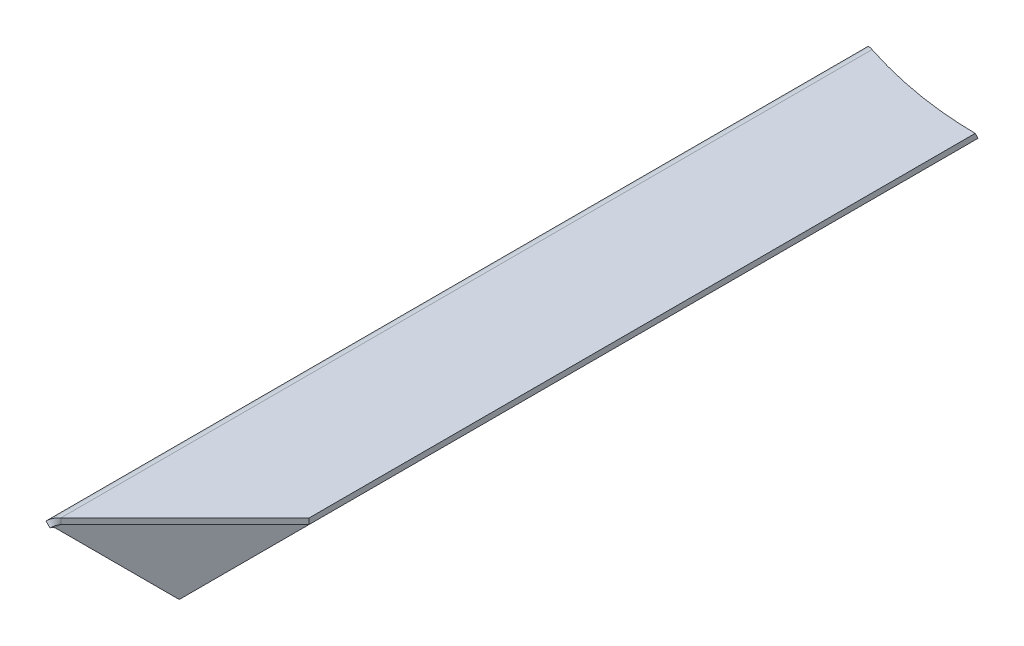
ISO-10303-21;
HEADER;
FILE_DESCRIPTION(('STEP AP214'),'2;1');
FILE_NAME('part.step','',(''),(''),'','','');
FILE_SCHEMA(('AUTOMOTIVE_DESIGN { 1 0 10303 214 1 1 1 1 }'));
ENDSEC;
DATA;
#1=APPLICATION_CONTEXT('core data for automotive mechanical design processes');
#2=APPLICATION_PROTOCOL_DEFINITION('international standard','automotive_design',2000,#1);
#3=PRODUCT_CONTEXT('',#1,'mechanical');
#4=PRODUCT('Part','Part','',(#3));
#5=PRODUCT_RELATED_PRODUCT_CATEGORY('part','',(#4));
#6=PRODUCT_DEFINITION_FORMATION('','',#4);
#7=PRODUCT_DEFINITION_CONTEXT('part definition',#1,'design');
#8=PRODUCT_DEFINITION('design','',#6,#7);
#9=PRODUCT_DEFINITION_SHAPE('','',#8);
#10=(LENGTH_UNIT() NAMED_UNIT(*) SI_UNIT(.MILLI.,.METRE.));
#11=(NAMED_UNIT(*) PLANE_ANGLE_UNIT() SI_UNIT($,.RADIAN.));
#12=(NAMED_UNIT(*) SI_UNIT($,.STERADIAN.) SOLID_ANGLE_UNIT());
#13=UNCERTAINTY_MEASURE_WITH_UNIT(LENGTH_MEASURE(1.E-05),#10,'distance_accuracy_value','');
#14=(GEOMETRIC_REPRESENTATION_CONTEXT(3) GLOBAL_UNCERTAINTY_ASSIGNED_CONTEXT((#13)) GLOBAL_UNIT_ASSIGNED_CONTEXT((#10,
#11,#12)) REPRESENTATION_CONTEXT('',''));
#15=CARTESIAN_POINT('',(0.,0.,0.));
#16=DIRECTION('',(0.,0.,1.));
#17=DIRECTION('',(1.,0.,0.));
#18=AXIS2_PLACEMENT_3D('',#15,#16,#17);
#19=CARTESIAN_POINT('',(-75.3461789999995,0.188336430725022,0.));
#20=DIRECTION('',(-1.,0.,0.));
#21=DIRECTION('',(0.,0.,1.));
#22=AXIS2_PLACEMENT_3D('',#19,#20,#21);
#23=PLANE('',#22);
#24=CARTESIAN_POINT('',(-75.3461789999999,59.5929013098403,-85.4549348179385));
#25=DIRECTION('',(-1.,0.,0.));
#26=DIRECTION('',(0.,-0.896707047194471,-0.442624526559218));
#27=AXIS2_PLACEMENT_3D('',#24,#25,#26);
#28=ELLIPSE('',#27,107.55436377684,44.45);
#29=CARTESIAN_POINT('',(-75.3461789999999,57.8815154307376,-37.5648409427278));
#30=VERTEX_POINT('',#29);
#31=CARTESIAN_POINT('',(-75.346179,73.8729789999998,-31.7875124451555));
#32=VERTEX_POINT('',#31);
#33=EDGE_CURVE('E53',#30,#32,#28,.T.);
#34=ORIENTED_EDGE('',*,*,#33,.F.);
#35=DIRECTION('',(0.,0.,-1.));
#36=VECTOR('',#35,1.);
#37=CARTESIAN_POINT('',(-75.3461789999999,57.8815154307375,57.6931790000015));
#38=LINE('',#37,#36);
#39=CARTESIAN_POINT('',(-75.3461789999999,57.8815154307375,57.6931790000015));
#40=VERTEX_POINT('',#39);
#41=EDGE_CURVE('E185',#40,#30,#38,.T.);
#42=ORIENTED_EDGE('',*,*,#41,.F.);
#43=DIRECTION('',(0.,-0.707106781186615,-0.70710678118648));
#44=VECTOR('',#43,1.);
#45=CARTESIAN_POINT('',(-75.346179,74.7407654307376,74.5524289999984));
#46=LINE('',#45,#44);
#47=CARTESIAN_POINT('',(-75.346179,73.8729789999997,73.6846425692607));
#48=VERTEX_POINT('',#47);
#49=EDGE_CURVE('E60',#48,#40,#46,.T.);
#50=ORIENTED_EDGE('',*,*,#49,.F.);
#51=DIRECTION('',(0.,0.,-1.));
#52=VECTOR('',#51,1.);
#53=CARTESIAN_POINT('',(-75.346179,73.8729789999997,0.));
#54=LINE('',#53,#52);
#55=EDGE_CURVE('E187',#48,#32,#54,.T.);
#56=ORIENTED_EDGE('',*,*,#55,.T.);
#57=EDGE_LOOP('',(#34,#42,#50,#56));
#58=FACE_BOUND('',#57,.T.);
#59=ADVANCED_FACE('F32',(#58),#23,.T.);
#60=CARTESIAN_POINT('',(-74.6095790000001,74.7407654307376,74.5524289999984));
#61=DIRECTION('',(0.,0.70710678118648,-0.707106781186615));
#62=DIRECTION('',(0.,0.707106781186615,0.70710678118648));
#63=AXIS2_PLACEMENT_3D('',#60,#61,#62);
#64=PLANE('',#63);
#65=CARTESIAN_POINT('',(-75.346179,73.8729789999997,73.6846425692607));
#66=CARTESIAN_POINT('',(-74.6095790000001,73.8729789999997,73.6846425692607));
#67=B_SPLINE_CURVE_WITH_KNOTS('',1,(#65,#66),.UNSPECIFIED.,.F.,.F.,(2,2),(0.,1.),.UNSPECIFIED.);
#68=CARTESIAN_POINT('',(-74.6095790000001,73.8729789999997,73.6846425692607));
#69=VERTEX_POINT('',#68);
#70=EDGE_CURVE('E46',#48,#69,#67,.T.);
#71=ORIENTED_EDGE('',*,*,#70,.F.);
#72=ORIENTED_EDGE('',*,*,#49,.T.);
#73=DIRECTION('',(-1.,0.,0.));
#74=VECTOR('',#73,1.);
#75=CARTESIAN_POINT('',(-74.6095789999999,57.8815154307375,57.6931790000015));
#76=LINE('',#75,#74);
#77=CARTESIAN_POINT('',(-74.6095789999999,57.8815154307375,57.6931790000015));
#78=VERTEX_POINT('',#77);
#79=EDGE_CURVE('E195',#78,#40,#76,.T.);
#80=ORIENTED_EDGE('',*,*,#79,.F.);
#81=DIRECTION('',(0.,-0.707106781186615,-0.70710678118648));
#82=VECTOR('',#81,1.);
#83=CARTESIAN_POINT('',(-74.6095790000001,74.7407654307376,74.5524289999984));
#84=LINE('',#83,#82);
#85=EDGE_CURVE('E196',#69,#78,#84,.T.);
#86=ORIENTED_EDGE('',*,*,#85,.F.);
#87=EDGE_LOOP('',(#71,#72,#80,#86));
#88=FACE_BOUND('',#87,.T.);
#89=ADVANCED_FACE('F34',(#88),#64,.F.);
#90=CARTESIAN_POINT('',(-74.6095789999999,57.8815154307375,57.6931790000015));
#91=DIRECTION('',(0.,1.,0.));
#92=DIRECTION('',(0.,0.,1.));
#93=AXIS2_PLACEMENT_3D('',#90,#91,#92);
#94=PLANE('',#93);
#95=ORIENTED_EDGE('',*,*,#41,.T.);
#96=CARTESIAN_POINT('',(-76.2123654834743,57.8815154307376,-86.2996938358005));
#97=DIRECTION('',(0.,1.,0.));
#98=DIRECTION('',(-0.715906273876113,0.,-0.698196395740353));
#99=AXIS2_PLACEMENT_3D('',#96,#97,#98);
#100=ELLIPSE('',#99,54.436662870583,44.45);
#101=CARTESIAN_POINT('',(-74.6095789999999,57.8815154307376,-37.4361436470366));
#102=VERTEX_POINT('',#101);
#103=EDGE_CURVE('E192',#30,#102,#100,.T.);
#104=ORIENTED_EDGE('',*,*,#103,.T.);
#105=DIRECTION('',(0.,0.,-1.));
#106=VECTOR('',#105,1.);
#107=CARTESIAN_POINT('',(-74.6095789999999,57.8815154307375,57.6931790000015));
#108=LINE('',#107,#106);
#109=EDGE_CURVE('E198',#78,#102,#108,.T.);
#110=ORIENTED_EDGE('',*,*,#109,.F.);
#111=ORIENTED_EDGE('',*,*,#79,.T.);
#112=EDGE_LOOP('',(#95,#104,#110,#111));
#113=FACE_BOUND('',#112,.T.);
#114=ADVANCED_FACE('F171',(#113),#94,.F.);
#115=CARTESIAN_POINT('',(-74.6095789999995,0.188336430725022,0.));
#116=DIRECTION('',(-1.,0.,0.));
#117=DIRECTION('',(0.,0.,1.));
#118=AXIS2_PLACEMENT_3D('',#115,#116,#117);
#119=PLANE('',#118);
#120=ORIENTED_EDGE('',*,*,#109,.T.);
#121=CARTESIAN_POINT('',(-74.609579,61.0482540111322,-84.7365566113643));
#122=DIRECTION('',(-1.,0.,0.));
#123=DIRECTION('',(0.,-0.896707047194471,-0.442624526559218));
#124=AXIS2_PLACEMENT_3D('',#121,#122,#123);
#125=ELLIPSE('',#124,107.55436377684,44.45);
#126=CARTESIAN_POINT('',(-74.609579,73.8729789999997,-31.5411856559985));
#127=VERTEX_POINT('',#126);
#128=EDGE_CURVE('E273',#102,#127,#125,.T.);
#129=ORIENTED_EDGE('',*,*,#128,.T.);
#130=DIRECTION('',(0.,0.,-1.));
#131=VECTOR('',#130,1.);
#132=CARTESIAN_POINT('',(-74.609579,73.8729789999997,0.));
#133=LINE('',#132,#131);
#134=EDGE_CURVE('E205',#69,#127,#133,.T.);
#135=ORIENTED_EDGE('',*,*,#134,.F.);
#136=ORIENTED_EDGE('',*,*,#85,.T.);
#137=EDGE_LOOP('',(#120,#129,#135,#136));
#138=FACE_BOUND('',#137,.T.);
#139=ADVANCED_FACE('F174',(#138),#119,.F.);
#140=CARTESIAN_POINT('',(-57.8815154307379,74.6095789999998,57.6931790000015));
#141=DIRECTION('',(-1.,0.,0.));
#142=DIRECTION('',(0.,0.,-1.));
#143=AXIS2_PLACEMENT_3D('',#140,#141,#142);
#144=PLANE('',#143);
#145=DIRECTION('',(0.,0.,1.));
#146=VECTOR('',#145,1.);
#147=CARTESIAN_POINT('',(-57.8815154307379,74.6095789999998,57.6931790000015));
#148=LINE('',#147,#146);
#149=CARTESIAN_POINT('',(-57.8815154307379,74.6095789999998,-28.4723694186372));
#150=VERTEX_POINT('',#149);
#151=CARTESIAN_POINT('',(-57.8815154307379,74.6095789999998,57.6931790000015));
#152=VERTEX_POINT('',#151);
#153=EDGE_CURVE('E141',#150,#152,#148,.T.);
#154=ORIENTED_EDGE('',*,*,#153,.F.);
#155=CARTESIAN_POINT('',(-57.8815154307379,94.0990719624067,-68.4223069421464));
#156=DIRECTION('',(-1.,0.,0.));
#157=DIRECTION('',(0.,-0.896707047194472,-0.442624526559218));
#158=AXIS2_PLACEMENT_3D('',#155,#156,#157);
#159=ELLIPSE('',#158,107.554363776841,44.45);
#160=CARTESIAN_POINT('',(-57.8815154307379,75.3461789999998,-28.1109438259411));
#161=VERTEX_POINT('',#160);
#162=EDGE_CURVE('E120',#150,#161,#159,.T.);
#163=ORIENTED_EDGE('',*,*,#162,.T.);
#164=DIRECTION('',(0.,0.,1.));
#165=VECTOR('',#164,1.);
#166=CARTESIAN_POINT('',(-57.8815154307379,75.3461789999998,57.6931790000015));
#167=LINE('',#166,#165);
#168=CARTESIAN_POINT('',(-57.8815154307379,75.3461789999998,57.6931790000015));
#169=VERTEX_POINT('',#168);
#170=EDGE_CURVE('E119',#161,#169,#167,.T.);
#171=ORIENTED_EDGE('',*,*,#170,.T.);
#172=DIRECTION('',(0.,1.,0.));
#173=VECTOR('',#172,1.);
#174=CARTESIAN_POINT('',(-57.8815154307379,74.6095789999998,57.6931790000015));
#175=LINE('',#174,#173);
#176=EDGE_CURVE('E200',#152,#169,#175,.T.);
#177=ORIENTED_EDGE('',*,*,#176,.F.);
#178=EDGE_LOOP('',(#154,#163,#171,#177));
#179=FACE_BOUND('',#178,.T.);
#180=ADVANCED_FACE('F177',(#179),#144,.F.);
#181=CARTESIAN_POINT('',(-149.29319443075,74.6095789999995,0.));
#182=DIRECTION('',(0.,1.,0.));
#183=DIRECTION('',(0.,0.,1.));
#184=AXIS2_PLACEMENT_3D('',#181,#182,#183);
#185=PLANE('',#184);
#186=DIRECTION('',(0.,0.,-1.));
#187=VECTOR('',#186,1.);
#188=CARTESIAN_POINT('',(-73.872979,74.6095789999997,0.));
#189=LINE('',#188,#187);
#190=CARTESIAN_POINT('',(-73.872979,74.6095789999997,73.6846425692607));
#191=VERTEX_POINT('',#190);
#192=CARTESIAN_POINT('',(-73.872979,74.6095789999997,-31.0599616019449));
#193=VERTEX_POINT('',#192);
#194=EDGE_CURVE('E138',#191,#193,#189,.T.);
#195=ORIENTED_EDGE('',*,*,#194,.T.);
#196=CARTESIAN_POINT('',(-67.7457638039089,74.6095789999998,-78.0425364500491));
#197=DIRECTION('',(0.,1.,0.));
#198=DIRECTION('',(-0.715906273876111,0.,-0.698196395740356));
#199=AXIS2_PLACEMENT_3D('',#196,#197,#198);
#200=ELLIPSE('',#199,54.4366628705829,44.45);
#201=EDGE_CURVE('E188',#193,#150,#200,.T.);
#202=ORIENTED_EDGE('',*,*,#201,.T.);
#203=ORIENTED_EDGE('',*,*,#153,.T.);
#204=DIRECTION('',(-0.707106781186614,0.,0.707106781186481));
#205=VECTOR('',#204,1.);
#206=CARTESIAN_POINT('',(-74.7407654307379,74.6095789999997,74.5524289999984));
#207=LINE('',#206,#205);
#208=EDGE_CURVE('E131',#152,#191,#207,.T.);
#209=ORIENTED_EDGE('',*,*,#208,.T.);
#210=EDGE_LOOP('',(#195,#202,#203,#209));
#211=FACE_BOUND('',#210,.T.);
#212=ADVANCED_FACE('F341',(#211),#185,.F.);
#213=CARTESIAN_POINT('',(-149.29319443075,75.3461789999995,0.));
#214=DIRECTION('',(0.,1.,0.));
#215=DIRECTION('',(0.,0.,1.));
#216=AXIS2_PLACEMENT_3D('',#213,#214,#215);
#217=PLANE('',#216);
#218=CARTESIAN_POINT('',(-67.3729472629299,75.3461789999998,-77.6789425346409));
#219=DIRECTION('',(0.,1.,0.));
#220=DIRECTION('',(-0.715906273876111,0.,-0.698196395740356));
#221=AXIS2_PLACEMENT_3D('',#218,#219,#220);
#222=ELLIPSE('',#221,54.4366628705829,44.45);
#223=CARTESIAN_POINT('',(-73.872979,75.3461789999998,-30.8169524684756));
#224=VERTEX_POINT('',#223);
#225=EDGE_CURVE('E108',#224,#161,#222,.T.);
#226=ORIENTED_EDGE('',*,*,#225,.F.);
#227=DIRECTION('',(0.,0.,-1.));
#228=VECTOR('',#227,1.);
#229=CARTESIAN_POINT('',(-73.872979,75.3461789999998,0.));
#230=LINE('',#229,#228);
#231=CARTESIAN_POINT('',(-73.8729790000001,75.3461789999997,73.6846425692607));
#232=VERTEX_POINT('',#231);
#233=EDGE_CURVE('E118',#232,#224,#230,.T.);
#234=ORIENTED_EDGE('',*,*,#233,.F.);
#235=DIRECTION('',(-0.707106781186614,0.,0.707106781186481));
#236=VECTOR('',#235,1.);
#237=CARTESIAN_POINT('',(-74.7407654307379,75.3461789999997,74.5524289999984));
#238=LINE('',#237,#236);
#239=EDGE_CURVE('E157',#169,#232,#238,.T.);
#240=ORIENTED_EDGE('',*,*,#239,.F.);
#241=ORIENTED_EDGE('',*,*,#170,.F.);
#242=EDGE_LOOP('',(#226,#234,#240,#241));
#243=FACE_BOUND('',#242,.T.);
#244=ADVANCED_FACE('F116',(#243),#217,.T.);
#245=CARTESIAN_POINT('',(-74.7407654307379,74.6095789999997,74.5524289999984));
#246=DIRECTION('',(-0.707106781186481,0.,-0.707106781186614));
#247=DIRECTION('',(0.707106781186614,0.,-0.707106781186481));
#248=AXIS2_PLACEMENT_3D('',#245,#246,#247);
#249=PLANE('',#248);
#250=ORIENTED_EDGE('',*,*,#239,.T.);
#251=CARTESIAN_POINT('',(-73.872979,74.6095789999997,73.6846425692607));
#252=CARTESIAN_POINT('',(-73.8729790000001,75.3461789999997,73.6846425692607));
#253=B_SPLINE_CURVE_WITH_KNOTS('',1,(#251,#252),.UNSPECIFIED.,.F.,.F.,(2,2),(0.,1.),.UNSPECIFIED.);
#254=EDGE_CURVE('E152',#232,#191,#253,.F.);
#255=ORIENTED_EDGE('',*,*,#254,.T.);
#256=ORIENTED_EDGE('',*,*,#208,.F.);
#257=ORIENTED_EDGE('',*,*,#176,.T.);
#258=EDGE_LOOP('',(#250,#255,#256,#257));
#259=FACE_BOUND('',#258,.T.);
#260=ADVANCED_FACE('F159',(#259),#249,.F.);
#261=CARTESIAN_POINT('',(-74.9146887100441,74.9146887100437,74.5524289999984));
#262=CARTESIAN_POINT('',(-75.0510639267768,74.778313493311,74.4077812391921));
#263=CARTESIAN_POINT('',(-75.1602411073236,74.6149104818821,74.2631668564191));
#264=CARTESIAN_POINT('',(-75.3078355472678,74.2585859832378,73.9739047128399));
#265=CARTESIAN_POINT('',(-75.346179,74.0658426810747,73.8292903300669));
#266=CARTESIAN_POINT('',(-75.346179,73.8729789999997,73.6846425692607));
#267=CARTESIAN_POINT('',(-74.3938338550221,74.3938338550217,74.5524289999984));
#268=CARTESIAN_POINT('',(-74.4620173784557,74.3256503315881,74.4077899046431));
#269=CARTESIAN_POINT('',(-74.5166100536618,74.2439447409409,74.2631668564191));
#270=CARTESIAN_POINT('',(-74.5904072736339,74.0657824916188,73.9739047128399));
#271=CARTESIAN_POINT('',(-74.6095790000001,73.9694050635699,73.829281664616));
#272=CARTESIAN_POINT('',(-74.6095790000001,73.8729789999997,73.6846425692607));
#273=B_SPLINE_SURFACE_WITH_KNOTS('',1,3,((#261,#262,#263,#264,#265,#266),(#267,#268,#269,#270,
#271,#272)),.UNSPECIFIED.,.F.,.F.,.F.,(2,2),(4,2,4),(0.,1.),(0.,0.5,1.),.UNSPECIFIED.);
#274=CARTESIAN_POINT('',(-74.9146887100441,74.9146887100437,74.5524289999984));
#275=CARTESIAN_POINT('',(-74.3938338550221,74.3938338550217,74.5524289999984));
#276=B_SPLINE_CURVE_WITH_KNOTS('',1,(#274,#275),.UNSPECIFIED.,.F.,.F.,(2,2),(0.,1.),.UNSPECIFIED.);
#277=CARTESIAN_POINT('',(-74.9146889457465,74.9146884743413,74.5524287499982));
#278=VERTEX_POINT('',#277);
#279=CARTESIAN_POINT('',(-74.3938338550221,74.3938338550217,74.5524289999984));
#280=VERTEX_POINT('',#279);
#281=EDGE_CURVE('E129',#278,#280,#276,.T.);
#282=CARTESIAN_POINT('',(-74.9146887100441,74.9146887100437,74.5524289999984));
#283=CARTESIAN_POINT('',(-75.0510639267768,74.778313493311,74.4077812391921));
#284=CARTESIAN_POINT('',(-75.1602411073236,74.6149104818821,74.2631668564191));
#285=CARTESIAN_POINT('',(-75.3078355472678,74.2585859832378,73.9739047128399));
#286=CARTESIAN_POINT('',(-75.346179,74.0658426810747,73.8292903300669));
#287=CARTESIAN_POINT('',(-75.346179,73.8729789999997,73.6846425692607));
#288=B_SPLINE_CURVE_WITH_KNOTS('',3,(#282,#283,#284,#285,#286,#287),.UNSPECIFIED.,.F.,.F.,(4,2,
4),(0.,0.5,1.),.UNSPECIFIED.);
#289=EDGE_CURVE('E234',#278,#48,#288,.T.);
#290=CARTESIAN_POINT('',(-74.6095790000001,73.8729789999997,73.6846425692607));
#291=CARTESIAN_POINT('',(-74.6095790000001,73.9694050635699,73.829281664616));
#292=CARTESIAN_POINT('',(-74.5904072736339,74.0657824916188,73.9739047128399));
#293=CARTESIAN_POINT('',(-74.5166100536618,74.2439447409409,74.2631668564191));
#294=CARTESIAN_POINT('',(-74.4620173784557,74.3256503315881,74.4077899046431));
#295=CARTESIAN_POINT('',(-74.3938338550221,74.3938338550217,74.5524289999984));
#296=B_SPLINE_CURVE_WITH_KNOTS('',3,(#290,#291,#292,#293,#294,#295),.UNSPECIFIED.,.F.,.F.,(4,2,
4),(0.,0.5,1.),.UNSPECIFIED.);
#297=EDGE_CURVE('E231',#280,#69,#296,.F.);
#298=ORIENTED_EDGE('',*,*,#281,.F.);
#299=ORIENTED_EDGE('',*,*,#289,.T.);
#300=ORIENTED_EDGE('',*,*,#70,.T.);
#301=ORIENTED_EDGE('',*,*,#297,.F.);
#302=EDGE_LOOP('',(#298,#299,#300,#301));
#303=FACE_BOUND('',#302,.T.);
#304=ADVANCED_FACE('F169',(#303),#273,.F.);
#305=CARTESIAN_POINT('',(-73.8729790000001,75.3461789999997,73.6846425692607));
#306=CARTESIAN_POINT('',(-74.065842681075,75.3461789999997,73.8292903300669));
#307=CARTESIAN_POINT('',(-74.2585859832381,75.3078355472675,73.9739047128399));
#308=CARTESIAN_POINT('',(-74.6149104818825,75.1602411073232,74.2631668564191));
#309=CARTESIAN_POINT('',(-74.7783134933114,75.0510639267765,74.4077812391921));
#310=CARTESIAN_POINT('',(-74.9146887100441,74.9146887100437,74.5524289999984));
#311=CARTESIAN_POINT('',(-73.872979,74.6095789999997,73.6846425692607));
#312=CARTESIAN_POINT('',(-73.9694050635703,74.6095789999997,73.829281664616));
#313=CARTESIAN_POINT('',(-74.0657824916191,74.5904072736336,73.9739047128399));
#314=CARTESIAN_POINT('',(-74.2439447409413,74.5166100536615,74.2631668564191));
#315=CARTESIAN_POINT('',(-74.3256503315884,74.4620173784554,74.4077899046431));
#316=CARTESIAN_POINT('',(-74.3938338550221,74.3938338550217,74.5524289999984));
#317=B_SPLINE_SURFACE_WITH_KNOTS('',1,3,((#305,#306,#307,#308,#309,#310),(#311,#312,#313,#314,
#315,#316)),.UNSPECIFIED.,.F.,.F.,.F.,(2,2),(4,2,4),(0.,1.),(0.,0.5,1.),.UNSPECIFIED.);
#318=CARTESIAN_POINT('',(-73.8729790000001,75.3461789999997,73.6846425692607));
#319=CARTESIAN_POINT('',(-74.065842681075,75.3461789999997,73.8292903300669));
#320=CARTESIAN_POINT('',(-74.2585859832381,75.3078355472675,73.9739047128399));
#321=CARTESIAN_POINT('',(-74.6149104818825,75.1602411073232,74.2631668564191));
#322=CARTESIAN_POINT('',(-74.7783134933114,75.0510639267765,74.4077812391921));
#323=CARTESIAN_POINT('',(-74.9146887100441,74.9146887100437,74.5524289999984));
#324=B_SPLINE_CURVE_WITH_KNOTS('',3,(#318,#319,#320,#321,#322,#323),.UNSPECIFIED.,.F.,.F.,(4,2,
4),(0.,0.5,1.),.UNSPECIFIED.);
#325=EDGE_CURVE('E126',#232,#278,#324,.T.);
#326=CARTESIAN_POINT('',(-74.3938338550221,74.3938338550217,74.5524289999984));
#327=CARTESIAN_POINT('',(-74.3256503315884,74.4620173784554,74.4077899046431));
#328=CARTESIAN_POINT('',(-74.2439447409413,74.5166100536615,74.2631668564191));
#329=CARTESIAN_POINT('',(-74.0657824916191,74.5904072736336,73.9739047128399));
#330=CARTESIAN_POINT('',(-73.9694050635703,74.6095789999997,73.829281664616));
#331=CARTESIAN_POINT('',(-73.872979,74.6095789999997,73.6846425692607));
#332=B_SPLINE_CURVE_WITH_KNOTS('',3,(#326,#327,#328,#329,#330,#331),.UNSPECIFIED.,.F.,.F.,(4,2,
4),(0.,0.5,1.),.UNSPECIFIED.);
#333=EDGE_CURVE('E133',#191,#280,#332,.F.);
#334=ORIENTED_EDGE('',*,*,#325,.T.);
#335=ORIENTED_EDGE('',*,*,#281,.T.);
#336=ORIENTED_EDGE('',*,*,#333,.F.);
#337=ORIENTED_EDGE('',*,*,#254,.F.);
#338=EDGE_LOOP('',(#334,#335,#336,#337));
#339=FACE_BOUND('',#338,.T.);
#340=ADVANCED_FACE('F261',(#339),#317,.F.);
#341=CARTESIAN_POINT('',(-73.8729790000001,73.8729789999997,149.116777969203));
#342=DIRECTION('',(0.,0.,-1.));
#343=DIRECTION('',(1.,0.,0.));
#344=AXIS2_PLACEMENT_3D('',#341,#342,#343);
#345=CYLINDRICAL_SURFACE('',#344,0.7366);
#346=CARTESIAN_POINT('',(-73.872979,74.6095789999998,-31.0599616019449));
#347=CARTESIAN_POINT('',(-73.9172662424923,74.6095976836771,-31.0741140961483));
#348=CARTESIAN_POINT('',(-73.9610672392346,74.6055896468219,-31.0895066671416));
#349=CARTESIAN_POINT('',(-74.046478976005,74.5901579664978,-31.1221278835133));
#350=CARTESIAN_POINT('',(-74.0880963143201,74.5787582420845,-31.1393504573321));
#351=CARTESIAN_POINT('',(-74.1681510051735,74.5491994117971,-31.1750546836289));
#352=CARTESIAN_POINT('',(-74.2065938641567,74.5310523242475,-31.1935340499885));
#353=CARTESIAN_POINT('',(-74.2795644663467,74.4886488645506,-31.2312626277672));
#354=CARTESIAN_POINT('',(-74.3140891247112,74.4643877264789,-31.2505124298511));
#355=CARTESIAN_POINT('',(-74.3804753225713,74.4087220556529,-31.2905020829446));
#356=CARTESIAN_POINT('',(-74.4120291083307,74.3769620710411,-31.3112590086713));
#357=CARTESIAN_POINT('',(-74.4689777250292,74.3081351018254,-31.3524942094557));
#358=CARTESIAN_POINT('',(-74.4943690228607,74.2710650921265,-31.3729723183407));
#359=CARTESIAN_POINT('',(-74.538596156863,74.1917831494913,-31.4134547199261));
#360=CARTESIAN_POINT('',(-74.5572906490857,74.1494831683073,-31.4334413317038));
#361=CARTESIAN_POINT('',(-74.5865337395116,74.061542391956,-31.4718331395567));
#362=CARTESIAN_POINT('',(-74.5971009286536,74.0159094843731,-31.4902418587087));
#363=CARTESIAN_POINT('',(-74.6053454838137,73.9534587937036,-31.513408467457));
#364=CARTESIAN_POINT('',(-74.6069282757365,73.9374644528648,-31.5191693548959));
#365=CARTESIAN_POINT('',(-74.609043898032,73.9053262430204,-31.5303993729878));
#366=CARTESIAN_POINT('',(-74.6095779635945,73.8891825724492,-31.5358688394774));
#367=CARTESIAN_POINT('',(-74.6095790000001,73.8729789999997,-31.5411856559985));
#368=B_SPLINE_CURVE_WITH_KNOTS('',3,(#346,#347,#348,#349,#350,#351,#352,#353,#354,#355,#356,
#357,#358,#359,#360,#361,#362,#363,#364,#365,#366,#367),.UNSPECIFIED.,.F.,.F.,(4,2,2,2,2,2,2,2,
2,2,4),(0.,0.139167439625803,0.277886774208337,0.416360198052857,0.554941898120739,
0.702312395164956,0.849767184843005,1.00017259320208,1.15023292235591,1.20142694822068,
1.25256064151897),.UNSPECIFIED.);
#369=EDGE_CURVE('E268',#193,#127,#368,.T.);
#370=ORIENTED_EDGE('',*,*,#369,.F.);
#371=ORIENTED_EDGE('',*,*,#194,.F.);
#372=ORIENTED_EDGE('',*,*,#333,.T.);
#373=ORIENTED_EDGE('',*,*,#297,.T.);
#374=ORIENTED_EDGE('',*,*,#134,.T.);
#375=EDGE_LOOP('',(#370,#371,#372,#373,#374));
#376=FACE_BOUND('',#375,.T.);
#377=ADVANCED_FACE('F241',(#376),#345,.F.);
#378=CARTESIAN_POINT('',(-73.8729790000001,73.8729789999997,149.116777969203));
#379=DIRECTION('',(0.,0.,-1.));
#380=DIRECTION('',(1.,0.,0.));
#381=AXIS2_PLACEMENT_3D('',#378,#379,#380);
#382=CYLINDRICAL_SURFACE('',#381,1.4732);
#383=ORIENTED_EDGE('',*,*,#233,.T.);
#384=CARTESIAN_POINT('',(-73.872979,75.3461789999998,-30.8169524684756));
#385=CARTESIAN_POINT('',(-73.96182227931,75.3462108767753,-30.8460091232986));
#386=CARTESIAN_POINT('',(-74.0496390138271,75.3381518031792,-30.8776235627689));
#387=CARTESIAN_POINT('',(-74.2208143372676,75.3071471344652,-30.9445821180585));
#388=CARTESIAN_POINT('',(-74.3041864920155,75.2842500226361,-30.9799137740321));
#389=CARTESIAN_POINT('',(-74.4645210710243,75.2249047250233,-31.0530571804885));
#390=CARTESIAN_POINT('',(-74.5414953189322,75.188482248381,-31.0908641143525));
#391=CARTESIAN_POINT('',(-74.6876083327173,75.1033649749589,-31.1679173026236));
#392=CARTESIAN_POINT('',(-74.7567406014893,75.0546601083027,-31.2071647153553));
#393=CARTESIAN_POINT('',(-74.8898259001445,74.9427398360714,-31.2886096283151));
#394=CARTESIAN_POINT('',(-74.9531407062403,74.8787815843709,-31.3308316095231));
#395=CARTESIAN_POINT('',(-75.0673607667348,74.7400685506052,-31.4144698571406));
#396=CARTESIAN_POINT('',(-75.1182591272132,74.6653078072387,-31.4558856642531));
#397=CARTESIAN_POINT('',(-75.2065654504487,74.5056842915088,-31.5372735262075));
#398=CARTESIAN_POINT('',(-75.2437568683735,74.420685380993,-31.5772141156037));
#399=CARTESIAN_POINT('',(-75.301730692997,74.2439169239766,-31.653601702518));
#400=CARTESIAN_POINT('',(-75.3225525450178,74.1521642395468,-31.6900569111279));
#401=CARTESIAN_POINT('',(-75.3383330454725,74.027939959129,-31.7351994669889));
#402=CARTESIAN_POINT('',(-75.3412665892142,73.9971361711498,-31.7460607980751));
#403=CARTESIAN_POINT('',(-75.3451874213407,73.9352519228214,-31.7672164556431));
#404=CARTESIAN_POINT('',(-75.3461769572002,73.9041718237429,-31.7775114234937));
#405=CARTESIAN_POINT('',(-75.346179,73.8729789999997,-31.7875124451555));
#406=B_SPLINE_CURVE_WITH_KNOTS('',3,(#384,#385,#386,#387,#388,#389,#390,#391,#392,#393,#394,
#395,#396,#397,#398,#399,#400,#401,#402,#403,#404,#405),.UNSPECIFIED.,.F.,.F.,(4,2,2,2,2,2,2,2,
2,2,4),(0.,0.279779093575057,0.558648587280031,0.83699069412902,1.11556174951556,
1.41242591905896,1.70945454175551,2.0109926903808,2.31180198395698,2.41013604469037,
2.50835635399897),.UNSPECIFIED.);
#407=EDGE_CURVE('E11',#224,#32,#406,.T.);
#408=ORIENTED_EDGE('',*,*,#407,.T.);
#409=ORIENTED_EDGE('',*,*,#55,.F.);
#410=ORIENTED_EDGE('',*,*,#289,.F.);
#411=ORIENTED_EDGE('',*,*,#325,.F.);
#412=EDGE_LOOP('',(#383,#408,#409,#410,#411));
#413=FACE_BOUND('',#412,.T.);
#414=ADVANCED_FACE('F123',(#413),#382,.T.);
#415=CARTESIAN_POINT('',(-40.3922364855664,128.653876953588,-51.3656726183498));
#416=DIRECTION('',(-0.413279372766564,-0.816545277686749,-0.403055789603802));
#417=DIRECTION('',(0.892228166379723,-0.451584874767388,0.));
#418=AXIS2_PLACEMENT_3D('',#415,#416,#417);
#419=CYLINDRICAL_SURFACE('',#418,44.45);
#420=ORIENTED_EDGE('',*,*,#103,.F.);
#421=ORIENTED_EDGE('',*,*,#33,.T.);
#422=ORIENTED_EDGE('',*,*,#407,.F.);
#423=ORIENTED_EDGE('',*,*,#225,.T.);
#424=ORIENTED_EDGE('',*,*,#162,.F.);
#425=ORIENTED_EDGE('',*,*,#201,.F.);
#426=ORIENTED_EDGE('',*,*,#369,.T.);
#427=ORIENTED_EDGE('',*,*,#128,.F.);
#428=EDGE_LOOP('',(#420,#421,#422,#423,#424,#425,#426,#427));
#429=FACE_BOUND('',#428,.T.);
#430=ADVANCED_FACE('F107',(#429),#419,.F.);
#431=CLOSED_SHELL('',(#59,#89,#114,#139,#180,#212,#244,#260,#304,#340,#377,#414,#430));
#432=MANIFOLD_SOLID_BREP('B2',#431);
#433=ADVANCED_BREP_SHAPE_REPRESENTATION('',(#18,#432),#14);
#434=SHAPE_DEFINITION_REPRESENTATION(#9,#433);
ENDSEC;
END-ISO-10303-21;
